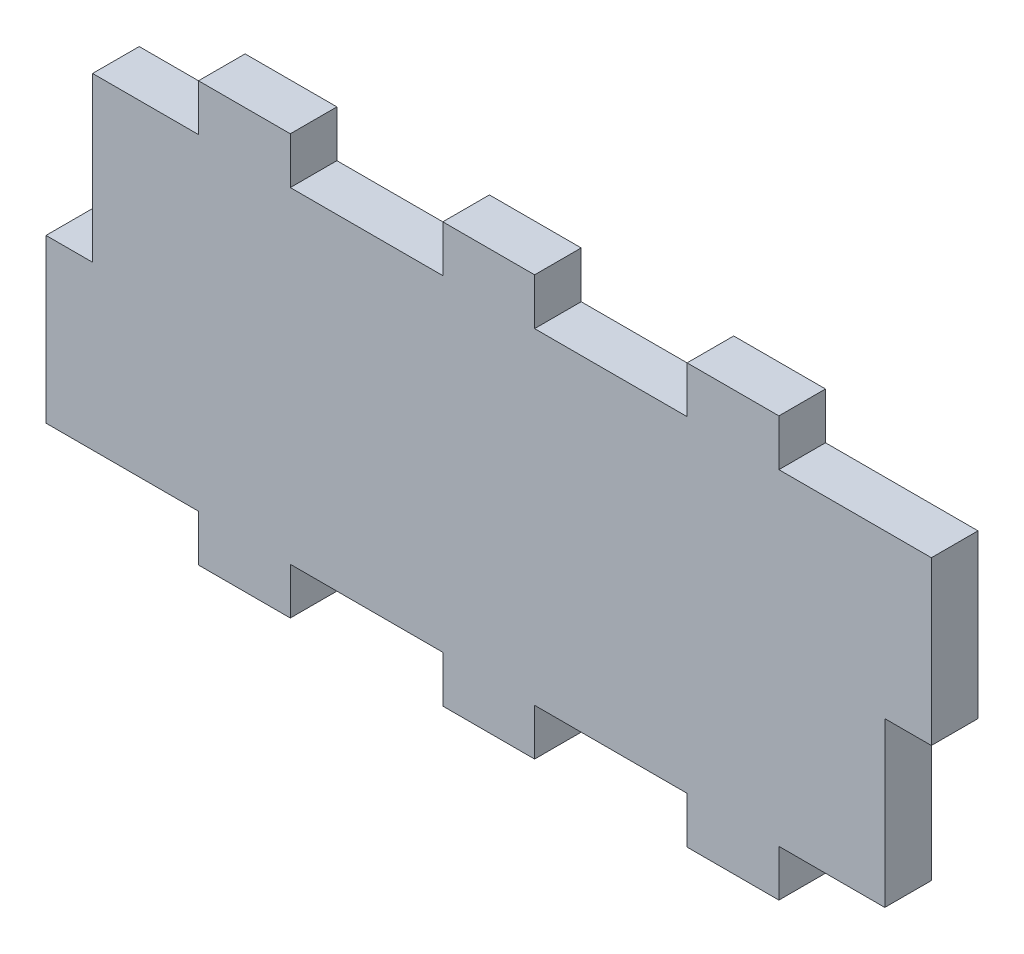
ISO-10303-21;
HEADER;
FILE_DESCRIPTION(('STEP AP214'),'2;1');
FILE_NAME('part.step','',(''),(''),'','','');
FILE_SCHEMA(('AUTOMOTIVE_DESIGN { 1 0 10303 214 1 1 1 1 }'));
ENDSEC;
DATA;
#1=APPLICATION_CONTEXT('core data for automotive mechanical design processes');
#2=APPLICATION_PROTOCOL_DEFINITION('international standard','automotive_design',2000,#1);
#3=PRODUCT_CONTEXT('',#1,'mechanical');
#4=PRODUCT('Part','Part','',(#3));
#5=PRODUCT_RELATED_PRODUCT_CATEGORY('part','',(#4));
#6=PRODUCT_DEFINITION_FORMATION('','',#4);
#7=PRODUCT_DEFINITION_CONTEXT('part definition',#1,'design');
#8=PRODUCT_DEFINITION('design','',#6,#7);
#9=PRODUCT_DEFINITION_SHAPE('','',#8);
#10=(LENGTH_UNIT() NAMED_UNIT(*) SI_UNIT(.MILLI.,.METRE.));
#11=(NAMED_UNIT(*) PLANE_ANGLE_UNIT() SI_UNIT($,.RADIAN.));
#12=(NAMED_UNIT(*) SI_UNIT($,.STERADIAN.) SOLID_ANGLE_UNIT());
#13=UNCERTAINTY_MEASURE_WITH_UNIT(LENGTH_MEASURE(1.E-05),#10,'distance_accuracy_value','');
#14=(GEOMETRIC_REPRESENTATION_CONTEXT(3) GLOBAL_UNCERTAINTY_ASSIGNED_CONTEXT((#13)) GLOBAL_UNIT_ASSIGNED_CONTEXT((#10,
#11,#12)) REPRESENTATION_CONTEXT('',''));
#15=CARTESIAN_POINT('',(0.,0.,0.));
#16=DIRECTION('',(0.,0.,1.));
#17=DIRECTION('',(1.,0.,0.));
#18=AXIS2_PLACEMENT_3D('',#15,#16,#17);
#19=CARTESIAN_POINT('',(0.,-17.5,5.));
#20=DIRECTION('',(0.,1.,0.));
#21=DIRECTION('',(-1.,0.,0.));
#22=AXIS2_PLACEMENT_3D('',#19,#20,#21);
#23=PLANE('',#22);
#24=DIRECTION('',(1.,0.,0.));
#25=VECTOR('',#24,1.);
#26=CARTESIAN_POINT('',(0.,-17.5,0.));
#27=LINE('',#26,#25);
#28=CARTESIAN_POINT('',(-47.5,-17.5,0.));
#29=VERTEX_POINT('',#28);
#30=CARTESIAN_POINT('',(-31.1375,-17.5,0.));
#31=VERTEX_POINT('',#30);
#32=EDGE_CURVE('E281',#29,#31,#27,.T.);
#33=ORIENTED_EDGE('',*,*,#32,.T.);
#34=DIRECTION('',(0.,0.,-1.));
#35=VECTOR('',#34,1.);
#36=CARTESIAN_POINT('',(-31.1375,-17.5,5.));
#37=LINE('',#36,#35);
#38=CARTESIAN_POINT('',(-31.1375,-17.5,5.));
#39=VERTEX_POINT('',#38);
#40=EDGE_CURVE('E11',#39,#31,#37,.T.);
#41=ORIENTED_EDGE('',*,*,#40,.F.);
#42=DIRECTION('',(1.,0.,0.));
#43=VECTOR('',#42,1.);
#44=CARTESIAN_POINT('',(0.,-17.5,5.));
#45=LINE('',#44,#43);
#46=CARTESIAN_POINT('',(-47.5,-17.5,5.));
#47=VERTEX_POINT('',#46);
#48=EDGE_CURVE('E357',#47,#39,#45,.T.);
#49=ORIENTED_EDGE('',*,*,#48,.F.);
#50=DIRECTION('',(0.,0.,-1.));
#51=VECTOR('',#50,1.);
#52=CARTESIAN_POINT('',(-47.5,-17.5,5.));
#53=LINE('',#52,#51);
#54=EDGE_CURVE('E52',#47,#29,#53,.T.);
#55=ORIENTED_EDGE('',*,*,#54,.T.);
#56=EDGE_LOOP('',(#33,#41,#49,#55));
#57=FACE_BOUND('',#56,.T.);
#58=ADVANCED_FACE('F35',(#57),#23,.F.);
#59=CARTESIAN_POINT('',(-31.1375,0.,5.));
#60=DIRECTION('',(1.,0.,0.));
#61=DIRECTION('',(0.,0.,-1.));
#62=AXIS2_PLACEMENT_3D('',#59,#60,#61);
#63=PLANE('',#62);
#64=DIRECTION('',(0.,-1.,0.));
#65=VECTOR('',#64,1.);
#66=CARTESIAN_POINT('',(-31.1375,0.,0.));
#67=LINE('',#66,#65);
#68=CARTESIAN_POINT('',(-31.1375,-22.5,0.));
#69=VERTEX_POINT('',#68);
#70=EDGE_CURVE('E283',#31,#69,#67,.T.);
#71=ORIENTED_EDGE('',*,*,#70,.T.);
#72=DIRECTION('',(0.,0.,-1.));
#73=VECTOR('',#72,1.);
#74=CARTESIAN_POINT('',(-31.1375,-22.5,5.));
#75=LINE('',#74,#73);
#76=CARTESIAN_POINT('',(-31.1375,-22.5,5.));
#77=VERTEX_POINT('',#76);
#78=EDGE_CURVE('E44',#77,#69,#75,.T.);
#79=ORIENTED_EDGE('',*,*,#78,.F.);
#80=DIRECTION('',(0.,-1.,0.));
#81=VECTOR('',#80,1.);
#82=CARTESIAN_POINT('',(-31.1375,0.,5.));
#83=LINE('',#82,#81);
#84=EDGE_CURVE('E163',#39,#77,#83,.T.);
#85=ORIENTED_EDGE('',*,*,#84,.F.);
#86=ORIENTED_EDGE('',*,*,#40,.T.);
#87=EDGE_LOOP('',(#71,#79,#85,#86));
#88=FACE_BOUND('',#87,.T.);
#89=ADVANCED_FACE('F37',(#88),#63,.F.);
#90=CARTESIAN_POINT('',(0.,-22.5,5.));
#91=DIRECTION('',(0.,1.,0.));
#92=DIRECTION('',(0.,0.,1.));
#93=AXIS2_PLACEMENT_3D('',#90,#91,#92);
#94=PLANE('',#93);
#95=DIRECTION('',(1.,0.,0.));
#96=VECTOR('',#95,1.);
#97=CARTESIAN_POINT('',(0.,-22.5,0.));
#98=LINE('',#97,#96);
#99=CARTESIAN_POINT('',(-21.2875,-22.5,0.));
#100=VERTEX_POINT('',#99);
#101=EDGE_CURVE('E287',#69,#100,#98,.T.);
#102=ORIENTED_EDGE('',*,*,#101,.T.);
#103=DIRECTION('',(0.,0.,-1.));
#104=VECTOR('',#103,1.);
#105=CARTESIAN_POINT('',(-21.2875,-22.5,5.));
#106=LINE('',#105,#104);
#107=CARTESIAN_POINT('',(-21.2875,-22.5,5.));
#108=VERTEX_POINT('',#107);
#109=EDGE_CURVE('E417',#108,#100,#106,.T.);
#110=ORIENTED_EDGE('',*,*,#109,.F.);
#111=DIRECTION('',(1.,0.,0.));
#112=VECTOR('',#111,1.);
#113=CARTESIAN_POINT('',(0.,-22.5,5.));
#114=LINE('',#113,#112);
#115=EDGE_CURVE('E424',#77,#108,#114,.T.);
#116=ORIENTED_EDGE('',*,*,#115,.F.);
#117=ORIENTED_EDGE('',*,*,#78,.T.);
#118=EDGE_LOOP('',(#102,#110,#116,#117));
#119=FACE_BOUND('',#118,.T.);
#120=ADVANCED_FACE('F422',(#119),#94,.F.);
#121=CARTESIAN_POINT('',(-21.2875,0.,5.));
#122=DIRECTION('',(1.,0.,0.));
#123=DIRECTION('',(0.,0.,-1.));
#124=AXIS2_PLACEMENT_3D('',#121,#122,#123);
#125=PLANE('',#124);
#126=DIRECTION('',(0.,-1.,0.));
#127=VECTOR('',#126,1.);
#128=CARTESIAN_POINT('',(-21.2875,0.,0.));
#129=LINE('',#128,#127);
#130=CARTESIAN_POINT('',(-21.2875,-17.5,0.));
#131=VERTEX_POINT('',#130);
#132=EDGE_CURVE('E290',#131,#100,#129,.T.);
#133=ORIENTED_EDGE('',*,*,#132,.F.);
#134=DIRECTION('',(0.,0.,-1.));
#135=VECTOR('',#134,1.);
#136=CARTESIAN_POINT('',(-21.2875,-17.5,5.));
#137=LINE('',#136,#135);
#138=CARTESIAN_POINT('',(-21.2875,-17.5,5.));
#139=VERTEX_POINT('',#138);
#140=EDGE_CURVE('E415',#139,#131,#137,.T.);
#141=ORIENTED_EDGE('',*,*,#140,.F.);
#142=DIRECTION('',(0.,-1.,0.));
#143=VECTOR('',#142,1.);
#144=CARTESIAN_POINT('',(-21.2875,0.,5.));
#145=LINE('',#144,#143);
#146=EDGE_CURVE('E435',#139,#108,#145,.T.);
#147=ORIENTED_EDGE('',*,*,#146,.T.);
#148=ORIENTED_EDGE('',*,*,#109,.T.);
#149=EDGE_LOOP('',(#133,#141,#147,#148));
#150=FACE_BOUND('',#149,.T.);
#151=ADVANCED_FACE('F431',(#150),#125,.T.);
#152=CARTESIAN_POINT('',(-4.92499999999999,-17.5,0.));
#153=VERTEX_POINT('',#152);
#154=EDGE_CURVE('E285',#131,#153,#27,.T.);
#155=ORIENTED_EDGE('',*,*,#154,.T.);
#156=DIRECTION('',(0.,0.,-1.));
#157=VECTOR('',#156,1.);
#158=CARTESIAN_POINT('',(-4.92499999999999,-17.5,5.));
#159=LINE('',#158,#157);
#160=CARTESIAN_POINT('',(-4.92499999999999,-17.5,5.));
#161=VERTEX_POINT('',#160);
#162=EDGE_CURVE('E412',#161,#153,#159,.T.);
#163=ORIENTED_EDGE('',*,*,#162,.F.);
#164=EDGE_CURVE('E436',#139,#161,#45,.T.);
#165=ORIENTED_EDGE('',*,*,#164,.F.);
#166=ORIENTED_EDGE('',*,*,#140,.T.);
#167=EDGE_LOOP('',(#155,#163,#165,#166));
#168=FACE_BOUND('',#167,.T.);
#169=ADVANCED_FACE('F511',(#168),#23,.F.);
#170=CARTESIAN_POINT('',(-4.92499999999999,0.,5.));
#171=DIRECTION('',(1.,0.,0.));
#172=DIRECTION('',(0.,0.,-1.));
#173=AXIS2_PLACEMENT_3D('',#170,#171,#172);
#174=PLANE('',#173);
#175=DIRECTION('',(0.,-1.,0.));
#176=VECTOR('',#175,1.);
#177=CARTESIAN_POINT('',(-4.92499999999999,0.,0.));
#178=LINE('',#177,#176);
#179=CARTESIAN_POINT('',(-4.92499999999999,-22.5,0.));
#180=VERTEX_POINT('',#179);
#181=EDGE_CURVE('E293',#153,#180,#178,.T.);
#182=ORIENTED_EDGE('',*,*,#181,.T.);
#183=DIRECTION('',(0.,0.,-1.));
#184=VECTOR('',#183,1.);
#185=CARTESIAN_POINT('',(-4.92499999999999,-22.5,5.));
#186=LINE('',#185,#184);
#187=CARTESIAN_POINT('',(-4.92499999999999,-22.5,5.));
#188=VERTEX_POINT('',#187);
#189=EDGE_CURVE('E409',#188,#180,#186,.T.);
#190=ORIENTED_EDGE('',*,*,#189,.F.);
#191=DIRECTION('',(0.,-1.,0.));
#192=VECTOR('',#191,1.);
#193=CARTESIAN_POINT('',(-4.92499999999999,0.,5.));
#194=LINE('',#193,#192);
#195=EDGE_CURVE('E438',#161,#188,#194,.T.);
#196=ORIENTED_EDGE('',*,*,#195,.F.);
#197=ORIENTED_EDGE('',*,*,#162,.T.);
#198=EDGE_LOOP('',(#182,#190,#196,#197));
#199=FACE_BOUND('',#198,.T.);
#200=ADVANCED_FACE('F519',(#199),#174,.F.);
#201=CARTESIAN_POINT('',(0.,-22.5,5.));
#202=DIRECTION('',(0.,1.,0.));
#203=DIRECTION('',(0.,0.,1.));
#204=AXIS2_PLACEMENT_3D('',#201,#202,#203);
#205=PLANE('',#204);
#206=DIRECTION('',(1.,0.,0.));
#207=VECTOR('',#206,1.);
#208=CARTESIAN_POINT('',(0.,-22.5,0.));
#209=LINE('',#208,#207);
#210=CARTESIAN_POINT('',(4.92500000000001,-22.5,0.));
#211=VERTEX_POINT('',#210);
#212=EDGE_CURVE('E295',#180,#211,#209,.T.);
#213=ORIENTED_EDGE('',*,*,#212,.T.);
#214=DIRECTION('',(0.,0.,-1.));
#215=VECTOR('',#214,1.);
#216=CARTESIAN_POINT('',(4.92500000000001,-22.5,5.));
#217=LINE('',#216,#215);
#218=CARTESIAN_POINT('',(4.92500000000001,-22.5,5.));
#219=VERTEX_POINT('',#218);
#220=EDGE_CURVE('E407',#219,#211,#217,.T.);
#221=ORIENTED_EDGE('',*,*,#220,.F.);
#222=DIRECTION('',(1.,0.,0.));
#223=VECTOR('',#222,1.);
#224=CARTESIAN_POINT('',(0.,-22.5,5.));
#225=LINE('',#224,#223);
#226=EDGE_CURVE('E445',#188,#219,#225,.T.);
#227=ORIENTED_EDGE('',*,*,#226,.F.);
#228=ORIENTED_EDGE('',*,*,#189,.T.);
#229=EDGE_LOOP('',(#213,#221,#227,#228));
#230=FACE_BOUND('',#229,.T.);
#231=ADVANCED_FACE('F544',(#230),#205,.F.);
#232=CARTESIAN_POINT('',(4.92500000000001,0.,5.));
#233=DIRECTION('',(1.,0.,0.));
#234=DIRECTION('',(0.,0.,-1.));
#235=AXIS2_PLACEMENT_3D('',#232,#233,#234);
#236=PLANE('',#235);
#237=DIRECTION('',(0.,-1.,0.));
#238=VECTOR('',#237,1.);
#239=CARTESIAN_POINT('',(4.92500000000001,0.,0.));
#240=LINE('',#239,#238);
#241=CARTESIAN_POINT('',(4.92500000000001,-17.5,0.));
#242=VERTEX_POINT('',#241);
#243=EDGE_CURVE('E298',#242,#211,#240,.T.);
#244=ORIENTED_EDGE('',*,*,#243,.F.);
#245=DIRECTION('',(0.,0.,-1.));
#246=VECTOR('',#245,1.);
#247=CARTESIAN_POINT('',(4.92500000000001,-17.5,5.));
#248=LINE('',#247,#246);
#249=CARTESIAN_POINT('',(4.92500000000001,-17.5,5.));
#250=VERTEX_POINT('',#249);
#251=EDGE_CURVE('E405',#250,#242,#248,.T.);
#252=ORIENTED_EDGE('',*,*,#251,.F.);
#253=DIRECTION('',(0.,-1.,0.));
#254=VECTOR('',#253,1.);
#255=CARTESIAN_POINT('',(4.92500000000001,0.,5.));
#256=LINE('',#255,#254);
#257=EDGE_CURVE('E447',#250,#219,#256,.T.);
#258=ORIENTED_EDGE('',*,*,#257,.T.);
#259=ORIENTED_EDGE('',*,*,#220,.T.);
#260=EDGE_LOOP('',(#244,#252,#258,#259));
#261=FACE_BOUND('',#260,.T.);
#262=ADVANCED_FACE('F536',(#261),#236,.T.);
#263=CARTESIAN_POINT('',(21.2875,-17.5,0.));
#264=VERTEX_POINT('',#263);
#265=EDGE_CURVE('E301',#242,#264,#27,.T.);
#266=ORIENTED_EDGE('',*,*,#265,.T.);
#267=DIRECTION('',(0.,0.,-1.));
#268=VECTOR('',#267,1.);
#269=CARTESIAN_POINT('',(21.2875,-17.5,5.));
#270=LINE('',#269,#268);
#271=CARTESIAN_POINT('',(21.2875,-17.5,5.));
#272=VERTEX_POINT('',#271);
#273=EDGE_CURVE('E402',#272,#264,#270,.T.);
#274=ORIENTED_EDGE('',*,*,#273,.F.);
#275=EDGE_CURVE('E440',#250,#272,#45,.T.);
#276=ORIENTED_EDGE('',*,*,#275,.F.);
#277=ORIENTED_EDGE('',*,*,#251,.T.);
#278=EDGE_LOOP('',(#266,#274,#276,#277));
#279=FACE_BOUND('',#278,.T.);
#280=ADVANCED_FACE('F521',(#279),#23,.F.);
#281=CARTESIAN_POINT('',(21.2875,0.,5.));
#282=DIRECTION('',(1.,0.,0.));
#283=DIRECTION('',(0.,0.,-1.));
#284=AXIS2_PLACEMENT_3D('',#281,#282,#283);
#285=PLANE('',#284);
#286=DIRECTION('',(0.,-1.,0.));
#287=VECTOR('',#286,1.);
#288=CARTESIAN_POINT('',(21.2875,0.,0.));
#289=LINE('',#288,#287);
#290=CARTESIAN_POINT('',(21.2875,-22.5,0.));
#291=VERTEX_POINT('',#290);
#292=EDGE_CURVE('E302',#264,#291,#289,.T.);
#293=ORIENTED_EDGE('',*,*,#292,.T.);
#294=DIRECTION('',(0.,0.,-1.));
#295=VECTOR('',#294,1.);
#296=CARTESIAN_POINT('',(21.2875,-22.5,5.));
#297=LINE('',#296,#295);
#298=CARTESIAN_POINT('',(21.2875,-22.5,5.));
#299=VERTEX_POINT('',#298);
#300=EDGE_CURVE('E399',#299,#291,#297,.T.);
#301=ORIENTED_EDGE('',*,*,#300,.F.);
#302=DIRECTION('',(0.,-1.,0.));
#303=VECTOR('',#302,1.);
#304=CARTESIAN_POINT('',(21.2875,0.,5.));
#305=LINE('',#304,#303);
#306=EDGE_CURVE('E450',#272,#299,#305,.T.);
#307=ORIENTED_EDGE('',*,*,#306,.F.);
#308=ORIENTED_EDGE('',*,*,#273,.T.);
#309=EDGE_LOOP('',(#293,#301,#307,#308));
#310=FACE_BOUND('',#309,.T.);
#311=ADVANCED_FACE('F535',(#310),#285,.F.);
#312=CARTESIAN_POINT('',(0.,-22.5,5.));
#313=DIRECTION('',(0.,1.,0.));
#314=DIRECTION('',(0.,0.,1.));
#315=AXIS2_PLACEMENT_3D('',#312,#313,#314);
#316=PLANE('',#315);
#317=DIRECTION('',(1.,0.,0.));
#318=VECTOR('',#317,1.);
#319=CARTESIAN_POINT('',(0.,-22.5,0.));
#320=LINE('',#319,#318);
#321=CARTESIAN_POINT('',(31.1375,-22.5,0.));
#322=VERTEX_POINT('',#321);
#323=EDGE_CURVE('E304',#291,#322,#320,.T.);
#324=ORIENTED_EDGE('',*,*,#323,.T.);
#325=DIRECTION('',(0.,0.,-1.));
#326=VECTOR('',#325,1.);
#327=CARTESIAN_POINT('',(31.1375,-22.5,5.));
#328=LINE('',#327,#326);
#329=CARTESIAN_POINT('',(31.1375,-22.5,5.));
#330=VERTEX_POINT('',#329);
#331=EDGE_CURVE('E397',#330,#322,#328,.T.);
#332=ORIENTED_EDGE('',*,*,#331,.F.);
#333=DIRECTION('',(1.,0.,0.));
#334=VECTOR('',#333,1.);
#335=CARTESIAN_POINT('',(0.,-22.5,5.));
#336=LINE('',#335,#334);
#337=EDGE_CURVE('E452',#299,#330,#336,.T.);
#338=ORIENTED_EDGE('',*,*,#337,.F.);
#339=ORIENTED_EDGE('',*,*,#300,.T.);
#340=EDGE_LOOP('',(#324,#332,#338,#339));
#341=FACE_BOUND('',#340,.T.);
#342=ADVANCED_FACE('F532',(#341),#316,.F.);
#343=CARTESIAN_POINT('',(31.1375,0.,5.));
#344=DIRECTION('',(1.,0.,0.));
#345=DIRECTION('',(0.,0.,-1.));
#346=AXIS2_PLACEMENT_3D('',#343,#344,#345);
#347=PLANE('',#346);
#348=DIRECTION('',(0.,-1.,0.));
#349=VECTOR('',#348,1.);
#350=CARTESIAN_POINT('',(31.1375,0.,0.));
#351=LINE('',#350,#349);
#352=CARTESIAN_POINT('',(31.1375,-17.5,0.));
#353=VERTEX_POINT('',#352);
#354=EDGE_CURVE('E307',#353,#322,#351,.T.);
#355=ORIENTED_EDGE('',*,*,#354,.F.);
#356=DIRECTION('',(0.,0.,-1.));
#357=VECTOR('',#356,1.);
#358=CARTESIAN_POINT('',(31.1375,-17.5,5.));
#359=LINE('',#358,#357);
#360=CARTESIAN_POINT('',(31.1375,-17.5,5.));
#361=VERTEX_POINT('',#360);
#362=EDGE_CURVE('E395',#361,#353,#359,.T.);
#363=ORIENTED_EDGE('',*,*,#362,.F.);
#364=DIRECTION('',(0.,-1.,0.));
#365=VECTOR('',#364,1.);
#366=CARTESIAN_POINT('',(31.1375,0.,5.));
#367=LINE('',#366,#365);
#368=EDGE_CURVE('E454',#361,#330,#367,.T.);
#369=ORIENTED_EDGE('',*,*,#368,.T.);
#370=ORIENTED_EDGE('',*,*,#331,.T.);
#371=EDGE_LOOP('',(#355,#363,#369,#370));
#372=FACE_BOUND('',#371,.T.);
#373=ADVANCED_FACE('F524',(#372),#347,.T.);
#374=CARTESIAN_POINT('',(42.5,-17.5,0.));
#375=VERTEX_POINT('',#374);
#376=EDGE_CURVE('E284',#353,#375,#27,.T.);
#377=ORIENTED_EDGE('',*,*,#376,.T.);
#378=DIRECTION('',(0.,0.,-1.));
#379=VECTOR('',#378,1.);
#380=CARTESIAN_POINT('',(42.5,-17.5,5.));
#381=LINE('',#380,#379);
#382=CARTESIAN_POINT('',(42.5,-17.5,5.));
#383=VERTEX_POINT('',#382);
#384=EDGE_CURVE('E392',#383,#375,#381,.T.);
#385=ORIENTED_EDGE('',*,*,#384,.F.);
#386=EDGE_CURVE('E457',#361,#383,#45,.T.);
#387=ORIENTED_EDGE('',*,*,#386,.F.);
#388=ORIENTED_EDGE('',*,*,#362,.T.);
#389=EDGE_LOOP('',(#377,#385,#387,#388));
#390=FACE_BOUND('',#389,.T.);
#391=ADVANCED_FACE('F512',(#390),#23,.F.);
#392=CARTESIAN_POINT('',(42.5,0.,5.));
#393=DIRECTION('',(-1.,0.,0.));
#394=DIRECTION('',(0.,-1.,0.));
#395=AXIS2_PLACEMENT_3D('',#392,#393,#394);
#396=PLANE('',#395);
#397=DIRECTION('',(0.,1.,0.));
#398=VECTOR('',#397,1.);
#399=CARTESIAN_POINT('',(42.5,0.,0.));
#400=LINE('',#399,#398);
#401=CARTESIAN_POINT('',(42.5,0.0500000000000118,0.));
#402=VERTEX_POINT('',#401);
#403=EDGE_CURVE('E310',#375,#402,#400,.T.);
#404=ORIENTED_EDGE('',*,*,#403,.T.);
#405=DIRECTION('',(0.,0.,-1.));
#406=VECTOR('',#405,1.);
#407=CARTESIAN_POINT('',(42.5,0.0500000000000118,5.));
#408=LINE('',#407,#406);
#409=CARTESIAN_POINT('',(42.5,0.0500000000000118,5.));
#410=VERTEX_POINT('',#409);
#411=EDGE_CURVE('E389',#410,#402,#408,.T.);
#412=ORIENTED_EDGE('',*,*,#411,.F.);
#413=DIRECTION('',(0.,1.,0.));
#414=VECTOR('',#413,1.);
#415=CARTESIAN_POINT('',(42.5,0.,5.));
#416=LINE('',#415,#414);
#417=EDGE_CURVE('E458',#383,#410,#416,.T.);
#418=ORIENTED_EDGE('',*,*,#417,.F.);
#419=ORIENTED_EDGE('',*,*,#384,.T.);
#420=EDGE_LOOP('',(#404,#412,#418,#419));
#421=FACE_BOUND('',#420,.T.);
#422=ADVANCED_FACE('F523',(#421),#396,.F.);
#423=CARTESIAN_POINT('',(0.,0.0500000000000118,5.));
#424=DIRECTION('',(0.,1.,0.));
#425=DIRECTION('',(0.,0.,1.));
#426=AXIS2_PLACEMENT_3D('',#423,#424,#425);
#427=PLANE('',#426);
#428=DIRECTION('',(1.,0.,0.));
#429=VECTOR('',#428,1.);
#430=CARTESIAN_POINT('',(0.,0.0500000000000118,0.));
#431=LINE('',#430,#429);
#432=CARTESIAN_POINT('',(47.5,0.0500000000000118,0.));
#433=VERTEX_POINT('',#432);
#434=EDGE_CURVE('E312',#402,#433,#431,.T.);
#435=ORIENTED_EDGE('',*,*,#434,.T.);
#436=DIRECTION('',(0.,0.,-1.));
#437=VECTOR('',#436,1.);
#438=CARTESIAN_POINT('',(47.5,0.0500000000000118,5.));
#439=LINE('',#438,#437);
#440=CARTESIAN_POINT('',(47.5,0.0500000000000118,5.));
#441=VERTEX_POINT('',#440);
#442=EDGE_CURVE('E387',#441,#433,#439,.T.);
#443=ORIENTED_EDGE('',*,*,#442,.F.);
#444=DIRECTION('',(1.,0.,0.));
#445=VECTOR('',#444,1.);
#446=CARTESIAN_POINT('',(0.,0.0500000000000118,5.));
#447=LINE('',#446,#445);
#448=EDGE_CURVE('E460',#410,#441,#447,.T.);
#449=ORIENTED_EDGE('',*,*,#448,.F.);
#450=ORIENTED_EDGE('',*,*,#411,.T.);
#451=EDGE_LOOP('',(#435,#443,#449,#450));
#452=FACE_BOUND('',#451,.T.);
#453=ADVANCED_FACE('F530',(#452),#427,.F.);
#454=CARTESIAN_POINT('',(47.5,1.13328639691322E-13,5.));
#455=DIRECTION('',(1.,0.,0.));
#456=DIRECTION('',(0.,1.,0.));
#457=AXIS2_PLACEMENT_3D('',#454,#455,#456);
#458=PLANE('',#457);
#459=DIRECTION('',(0.,-1.,0.));
#460=VECTOR('',#459,1.);
#461=CARTESIAN_POINT('',(47.5,1.13328639691322E-13,0.));
#462=LINE('',#461,#460);
#463=CARTESIAN_POINT('',(47.5,17.5,0.));
#464=VERTEX_POINT('',#463);
#465=EDGE_CURVE('E315',#464,#433,#462,.T.);
#466=ORIENTED_EDGE('',*,*,#465,.F.);
#467=DIRECTION('',(0.,0.,-1.));
#468=VECTOR('',#467,1.);
#469=CARTESIAN_POINT('',(47.5,17.5,5.));
#470=LINE('',#469,#468);
#471=CARTESIAN_POINT('',(47.5,17.5,5.));
#472=VERTEX_POINT('',#471);
#473=EDGE_CURVE('E385',#472,#464,#470,.T.);
#474=ORIENTED_EDGE('',*,*,#473,.F.);
#475=DIRECTION('',(0.,-1.,0.));
#476=VECTOR('',#475,1.);
#477=CARTESIAN_POINT('',(47.5,1.13328639691322E-13,5.));
#478=LINE('',#477,#476);
#479=EDGE_CURVE('E462',#472,#441,#478,.T.);
#480=ORIENTED_EDGE('',*,*,#479,.T.);
#481=ORIENTED_EDGE('',*,*,#442,.T.);
#482=EDGE_LOOP('',(#466,#474,#480,#481));
#483=FACE_BOUND('',#482,.T.);
#484=ADVANCED_FACE('F634',(#483),#458,.T.);
#485=CARTESIAN_POINT('',(0.,17.5,5.));
#486=DIRECTION('',(0.,1.,0.));
#487=DIRECTION('',(0.,0.,1.));
#488=AXIS2_PLACEMENT_3D('',#485,#486,#487);
#489=PLANE('',#488);
#490=DIRECTION('',(1.,0.,0.));
#491=VECTOR('',#490,1.);
#492=CARTESIAN_POINT('',(0.,17.5,0.));
#493=LINE('',#492,#491);
#494=CARTESIAN_POINT('',(31.1374999999999,17.5,0.));
#495=VERTEX_POINT('',#494);
#496=EDGE_CURVE('E318',#495,#464,#493,.T.);
#497=ORIENTED_EDGE('',*,*,#496,.F.);
#498=DIRECTION('',(0.,0.,-1.));
#499=VECTOR('',#498,1.);
#500=CARTESIAN_POINT('',(31.1374999999999,17.5,5.));
#501=LINE('',#500,#499);
#502=CARTESIAN_POINT('',(31.1374999999999,17.5,5.));
#503=VERTEX_POINT('',#502);
#504=EDGE_CURVE('E383',#503,#495,#501,.T.);
#505=ORIENTED_EDGE('',*,*,#504,.F.);
#506=DIRECTION('',(1.,0.,0.));
#507=VECTOR('',#506,1.);
#508=CARTESIAN_POINT('',(0.,17.5,5.));
#509=LINE('',#508,#507);
#510=EDGE_CURVE('E276',#503,#472,#509,.T.);
#511=ORIENTED_EDGE('',*,*,#510,.T.);
#512=ORIENTED_EDGE('',*,*,#473,.T.);
#513=EDGE_LOOP('',(#497,#505,#511,#512));
#514=FACE_BOUND('',#513,.T.);
#515=ADVANCED_FACE('F578',(#514),#489,.T.);
#516=CARTESIAN_POINT('',(31.1374999999999,0.,5.));
#517=DIRECTION('',(1.,0.,0.));
#518=DIRECTION('',(0.,0.,-1.));
#519=AXIS2_PLACEMENT_3D('',#516,#517,#518);
#520=PLANE('',#519);
#521=DIRECTION('',(0.,-1.,0.));
#522=VECTOR('',#521,1.);
#523=CARTESIAN_POINT('',(31.1374999999999,0.,0.));
#524=LINE('',#523,#522);
#525=CARTESIAN_POINT('',(31.1374999999999,22.5,0.));
#526=VERTEX_POINT('',#525);
#527=EDGE_CURVE('E321',#526,#495,#524,.T.);
#528=ORIENTED_EDGE('',*,*,#527,.F.);
#529=DIRECTION('',(0.,0.,-1.));
#530=VECTOR('',#529,1.);
#531=CARTESIAN_POINT('',(31.1374999999999,22.5,5.));
#532=LINE('',#531,#530);
#533=CARTESIAN_POINT('',(31.1374999999999,22.5,5.));
#534=VERTEX_POINT('',#533);
#535=EDGE_CURVE('E381',#534,#526,#532,.T.);
#536=ORIENTED_EDGE('',*,*,#535,.F.);
#537=DIRECTION('',(0.,-1.,0.));
#538=VECTOR('',#537,1.);
#539=CARTESIAN_POINT('',(31.1374999999999,0.,5.));
#540=LINE('',#539,#538);
#541=EDGE_CURVE('E466',#534,#503,#540,.T.);
#542=ORIENTED_EDGE('',*,*,#541,.T.);
#543=ORIENTED_EDGE('',*,*,#504,.T.);
#544=EDGE_LOOP('',(#528,#536,#542,#543));
#545=FACE_BOUND('',#544,.T.);
#546=ADVANCED_FACE('F582',(#545),#520,.T.);
#547=CARTESIAN_POINT('',(0.,22.5,5.));
#548=DIRECTION('',(0.,1.,0.));
#549=DIRECTION('',(-1.,0.,0.));
#550=AXIS2_PLACEMENT_3D('',#547,#548,#549);
#551=PLANE('',#550);
#552=DIRECTION('',(1.,0.,0.));
#553=VECTOR('',#552,1.);
#554=CARTESIAN_POINT('',(0.,22.5,0.));
#555=LINE('',#554,#553);
#556=CARTESIAN_POINT('',(21.2874999999999,22.5,0.));
#557=VERTEX_POINT('',#556);
#558=EDGE_CURVE('E326',#557,#526,#555,.T.);
#559=ORIENTED_EDGE('',*,*,#558,.F.);
#560=DIRECTION('',(0.,0.,-1.));
#561=VECTOR('',#560,1.);
#562=CARTESIAN_POINT('',(21.2874999999999,22.5,5.));
#563=LINE('',#562,#561);
#564=CARTESIAN_POINT('',(21.2874999999999,22.5,5.));
#565=VERTEX_POINT('',#564);
#566=EDGE_CURVE('E379',#565,#557,#563,.T.);
#567=ORIENTED_EDGE('',*,*,#566,.F.);
#568=DIRECTION('',(1.,0.,0.));
#569=VECTOR('',#568,1.);
#570=CARTESIAN_POINT('',(0.,22.5,5.));
#571=LINE('',#570,#569);
#572=EDGE_CURVE('E470',#565,#534,#571,.T.);
#573=ORIENTED_EDGE('',*,*,#572,.T.);
#574=ORIENTED_EDGE('',*,*,#535,.T.);
#575=EDGE_LOOP('',(#559,#567,#573,#574));
#576=FACE_BOUND('',#575,.T.);
#577=ADVANCED_FACE('F586',(#576),#551,.T.);
#578=CARTESIAN_POINT('',(21.2874999999999,0.,5.));
#579=DIRECTION('',(1.,0.,0.));
#580=DIRECTION('',(0.,0.,-1.));
#581=AXIS2_PLACEMENT_3D('',#578,#579,#580);
#582=PLANE('',#581);
#583=DIRECTION('',(0.,-1.,0.));
#584=VECTOR('',#583,1.);
#585=CARTESIAN_POINT('',(21.2874999999999,0.,0.));
#586=LINE('',#585,#584);
#587=CARTESIAN_POINT('',(21.2874999999999,17.5,0.));
#588=VERTEX_POINT('',#587);
#589=EDGE_CURVE('E329',#557,#588,#586,.T.);
#590=ORIENTED_EDGE('',*,*,#589,.T.);
#591=DIRECTION('',(0.,0.,-1.));
#592=VECTOR('',#591,1.);
#593=CARTESIAN_POINT('',(21.2874999999999,17.5,5.));
#594=LINE('',#593,#592);
#595=CARTESIAN_POINT('',(21.2874999999999,17.5,5.));
#596=VERTEX_POINT('',#595);
#597=EDGE_CURVE('E377',#596,#588,#594,.T.);
#598=ORIENTED_EDGE('',*,*,#597,.F.);
#599=DIRECTION('',(0.,-1.,0.));
#600=VECTOR('',#599,1.);
#601=CARTESIAN_POINT('',(21.2874999999999,0.,5.));
#602=LINE('',#601,#600);
#603=EDGE_CURVE('E473',#565,#596,#602,.T.);
#604=ORIENTED_EDGE('',*,*,#603,.F.);
#605=ORIENTED_EDGE('',*,*,#566,.T.);
#606=EDGE_LOOP('',(#590,#598,#604,#605));
#607=FACE_BOUND('',#606,.T.);
#608=ADVANCED_FACE('F591',(#607),#582,.F.);
#609=CARTESIAN_POINT('',(4.92499999999987,17.5,0.));
#610=VERTEX_POINT('',#609);
#611=EDGE_CURVE('E323',#610,#588,#493,.T.);
#612=ORIENTED_EDGE('',*,*,#611,.F.);
#613=DIRECTION('',(0.,0.,-1.));
#614=VECTOR('',#613,1.);
#615=CARTESIAN_POINT('',(4.92499999999987,17.5,5.));
#616=LINE('',#615,#614);
#617=CARTESIAN_POINT('',(4.92499999999987,17.5,5.));
#618=VERTEX_POINT('',#617);
#619=EDGE_CURVE('E375',#618,#610,#616,.T.);
#620=ORIENTED_EDGE('',*,*,#619,.F.);
#621=EDGE_CURVE('E467',#618,#596,#509,.T.);
#622=ORIENTED_EDGE('',*,*,#621,.T.);
#623=ORIENTED_EDGE('',*,*,#597,.T.);
#624=EDGE_LOOP('',(#612,#620,#622,#623));
#625=FACE_BOUND('',#624,.T.);
#626=ADVANCED_FACE('F621',(#625),#489,.T.);
#627=CARTESIAN_POINT('',(4.92499999999987,0.,5.));
#628=DIRECTION('',(1.,0.,0.));
#629=DIRECTION('',(0.,0.,-1.));
#630=AXIS2_PLACEMENT_3D('',#627,#628,#629);
#631=PLANE('',#630);
#632=DIRECTION('',(0.,-1.,0.));
#633=VECTOR('',#632,1.);
#634=CARTESIAN_POINT('',(4.92499999999987,0.,0.));
#635=LINE('',#634,#633);
#636=CARTESIAN_POINT('',(4.92499999999987,22.5,0.));
#637=VERTEX_POINT('',#636);
#638=EDGE_CURVE('E332',#637,#610,#635,.T.);
#639=ORIENTED_EDGE('',*,*,#638,.F.);
#640=DIRECTION('',(0.,0.,-1.));
#641=VECTOR('',#640,1.);
#642=CARTESIAN_POINT('',(4.92499999999987,22.5,5.));
#643=LINE('',#642,#641);
#644=CARTESIAN_POINT('',(4.92499999999987,22.5,5.));
#645=VERTEX_POINT('',#644);
#646=EDGE_CURVE('E373',#645,#637,#643,.T.);
#647=ORIENTED_EDGE('',*,*,#646,.F.);
#648=DIRECTION('',(0.,-1.,0.));
#649=VECTOR('',#648,1.);
#650=CARTESIAN_POINT('',(4.92499999999987,0.,5.));
#651=LINE('',#650,#649);
#652=EDGE_CURVE('E475',#645,#618,#651,.T.);
#653=ORIENTED_EDGE('',*,*,#652,.T.);
#654=ORIENTED_EDGE('',*,*,#619,.T.);
#655=EDGE_LOOP('',(#639,#647,#653,#654));
#656=FACE_BOUND('',#655,.T.);
#657=ADVANCED_FACE('F599',(#656),#631,.T.);
#658=CARTESIAN_POINT('',(0.,22.5,5.));
#659=DIRECTION('',(0.,1.,0.));
#660=DIRECTION('',(-1.,0.,0.));
#661=AXIS2_PLACEMENT_3D('',#658,#659,#660);
#662=PLANE('',#661);
#663=DIRECTION('',(1.,0.,0.));
#664=VECTOR('',#663,1.);
#665=CARTESIAN_POINT('',(0.,22.5,0.));
#666=LINE('',#665,#664);
#667=CARTESIAN_POINT('',(-4.92500000000013,22.5,0.));
#668=VERTEX_POINT('',#667);
#669=EDGE_CURVE('E335',#668,#637,#666,.T.);
#670=ORIENTED_EDGE('',*,*,#669,.F.);
#671=DIRECTION('',(0.,0.,-1.));
#672=VECTOR('',#671,1.);
#673=CARTESIAN_POINT('',(-4.92500000000013,22.5,5.));
#674=LINE('',#673,#672);
#675=CARTESIAN_POINT('',(-4.92500000000013,22.5,5.));
#676=VERTEX_POINT('',#675);
#677=EDGE_CURVE('E371',#676,#668,#674,.T.);
#678=ORIENTED_EDGE('',*,*,#677,.F.);
#679=DIRECTION('',(1.,0.,0.));
#680=VECTOR('',#679,1.);
#681=CARTESIAN_POINT('',(0.,22.5,5.));
#682=LINE('',#681,#680);
#683=EDGE_CURVE('E478',#676,#645,#682,.T.);
#684=ORIENTED_EDGE('',*,*,#683,.T.);
#685=ORIENTED_EDGE('',*,*,#646,.T.);
#686=EDGE_LOOP('',(#670,#678,#684,#685));
#687=FACE_BOUND('',#686,.T.);
#688=ADVANCED_FACE('F603',(#687),#662,.T.);
#689=CARTESIAN_POINT('',(-4.92500000000013,0.,5.));
#690=DIRECTION('',(1.,0.,0.));
#691=DIRECTION('',(0.,0.,-1.));
#692=AXIS2_PLACEMENT_3D('',#689,#690,#691);
#693=PLANE('',#692);
#694=DIRECTION('',(0.,-1.,0.));
#695=VECTOR('',#694,1.);
#696=CARTESIAN_POINT('',(-4.92500000000013,0.,0.));
#697=LINE('',#696,#695);
#698=CARTESIAN_POINT('',(-4.92500000000013,17.5,0.));
#699=VERTEX_POINT('',#698);
#700=EDGE_CURVE('E338',#668,#699,#697,.T.);
#701=ORIENTED_EDGE('',*,*,#700,.T.);
#702=DIRECTION('',(0.,0.,-1.));
#703=VECTOR('',#702,1.);
#704=CARTESIAN_POINT('',(-4.92500000000013,17.5,5.));
#705=LINE('',#704,#703);
#706=CARTESIAN_POINT('',(-4.92500000000013,17.5,5.));
#707=VERTEX_POINT('',#706);
#708=EDGE_CURVE('E369',#707,#699,#705,.T.);
#709=ORIENTED_EDGE('',*,*,#708,.F.);
#710=DIRECTION('',(0.,-1.,0.));
#711=VECTOR('',#710,1.);
#712=CARTESIAN_POINT('',(-4.92500000000013,0.,5.));
#713=LINE('',#712,#711);
#714=EDGE_CURVE('E481',#676,#707,#713,.T.);
#715=ORIENTED_EDGE('',*,*,#714,.F.);
#716=ORIENTED_EDGE('',*,*,#677,.T.);
#717=EDGE_LOOP('',(#701,#709,#715,#716));
#718=FACE_BOUND('',#717,.T.);
#719=ADVANCED_FACE('F609',(#718),#693,.F.);
#720=CARTESIAN_POINT('',(-21.2875000000001,17.5,0.));
#721=VERTEX_POINT('',#720);
#722=EDGE_CURVE('E341',#721,#699,#493,.T.);
#723=ORIENTED_EDGE('',*,*,#722,.F.);
#724=DIRECTION('',(0.,0.,-1.));
#725=VECTOR('',#724,1.);
#726=CARTESIAN_POINT('',(-21.2875000000001,17.5,5.));
#727=LINE('',#726,#725);
#728=CARTESIAN_POINT('',(-21.2875000000001,17.5,5.));
#729=VERTEX_POINT('',#728);
#730=EDGE_CURVE('E367',#729,#721,#727,.T.);
#731=ORIENTED_EDGE('',*,*,#730,.F.);
#732=EDGE_CURVE('E275',#729,#707,#509,.T.);
#733=ORIENTED_EDGE('',*,*,#732,.T.);
#734=ORIENTED_EDGE('',*,*,#708,.T.);
#735=EDGE_LOOP('',(#723,#731,#733,#734));
#736=FACE_BOUND('',#735,.T.);
#737=ADVANCED_FACE('F614',(#736),#489,.T.);
#738=CARTESIAN_POINT('',(-21.2875000000001,0.,5.));
#739=DIRECTION('',(1.,0.,0.));
#740=DIRECTION('',(0.,0.,-1.));
#741=AXIS2_PLACEMENT_3D('',#738,#739,#740);
#742=PLANE('',#741);
#743=DIRECTION('',(0.,-1.,0.));
#744=VECTOR('',#743,1.);
#745=CARTESIAN_POINT('',(-21.2875000000001,0.,0.));
#746=LINE('',#745,#744);
#747=CARTESIAN_POINT('',(-21.2875000000001,22.5,0.));
#748=VERTEX_POINT('',#747);
#749=EDGE_CURVE('E342',#748,#721,#746,.T.);
#750=ORIENTED_EDGE('',*,*,#749,.F.);
#751=DIRECTION('',(0.,0.,-1.));
#752=VECTOR('',#751,1.);
#753=CARTESIAN_POINT('',(-21.2875000000001,22.5,5.));
#754=LINE('',#753,#752);
#755=CARTESIAN_POINT('',(-21.2875000000001,22.5,5.));
#756=VERTEX_POINT('',#755);
#757=EDGE_CURVE('E365',#756,#748,#754,.T.);
#758=ORIENTED_EDGE('',*,*,#757,.F.);
#759=DIRECTION('',(0.,-1.,0.));
#760=VECTOR('',#759,1.);
#761=CARTESIAN_POINT('',(-21.2875000000001,0.,5.));
#762=LINE('',#761,#760);
#763=EDGE_CURVE('E483',#756,#729,#762,.T.);
#764=ORIENTED_EDGE('',*,*,#763,.T.);
#765=ORIENTED_EDGE('',*,*,#730,.T.);
#766=EDGE_LOOP('',(#750,#758,#764,#765));
#767=FACE_BOUND('',#766,.T.);
#768=ADVANCED_FACE('F617',(#767),#742,.T.);
#769=CARTESIAN_POINT('',(0.,22.5,5.));
#770=DIRECTION('',(0.,1.,0.));
#771=DIRECTION('',(-1.,0.,0.));
#772=AXIS2_PLACEMENT_3D('',#769,#770,#771);
#773=PLANE('',#772);
#774=DIRECTION('',(1.,0.,0.));
#775=VECTOR('',#774,1.);
#776=CARTESIAN_POINT('',(0.,22.5,0.));
#777=LINE('',#776,#775);
#778=CARTESIAN_POINT('',(-31.1375000000001,22.5,0.));
#779=VERTEX_POINT('',#778);
#780=EDGE_CURVE('E345',#779,#748,#777,.T.);
#781=ORIENTED_EDGE('',*,*,#780,.F.);
#782=DIRECTION('',(0.,0.,-1.));
#783=VECTOR('',#782,1.);
#784=CARTESIAN_POINT('',(-31.1375000000001,22.5,5.));
#785=LINE('',#784,#783);
#786=CARTESIAN_POINT('',(-31.1375000000001,22.5,5.));
#787=VERTEX_POINT('',#786);
#788=EDGE_CURVE('E363',#787,#779,#785,.T.);
#789=ORIENTED_EDGE('',*,*,#788,.F.);
#790=DIRECTION('',(1.,0.,0.));
#791=VECTOR('',#790,1.);
#792=CARTESIAN_POINT('',(0.,22.5,5.));
#793=LINE('',#792,#791);
#794=EDGE_CURVE('E485',#787,#756,#793,.T.);
#795=ORIENTED_EDGE('',*,*,#794,.T.);
#796=ORIENTED_EDGE('',*,*,#757,.T.);
#797=EDGE_LOOP('',(#781,#789,#795,#796));
#798=FACE_BOUND('',#797,.T.);
#799=ADVANCED_FACE('F619',(#798),#773,.T.);
#800=CARTESIAN_POINT('',(-31.1375000000001,0.,5.));
#801=DIRECTION('',(1.,0.,0.));
#802=DIRECTION('',(0.,0.,-1.));
#803=AXIS2_PLACEMENT_3D('',#800,#801,#802);
#804=PLANE('',#803);
#805=DIRECTION('',(0.,-1.,0.));
#806=VECTOR('',#805,1.);
#807=CARTESIAN_POINT('',(-31.1375000000001,0.,0.));
#808=LINE('',#807,#806);
#809=CARTESIAN_POINT('',(-31.1375000000001,17.5,0.));
#810=VERTEX_POINT('',#809);
#811=EDGE_CURVE('E348',#779,#810,#808,.T.);
#812=ORIENTED_EDGE('',*,*,#811,.T.);
#813=DIRECTION('',(0.,0.,-1.));
#814=VECTOR('',#813,1.);
#815=CARTESIAN_POINT('',(-31.1375000000001,17.5,5.));
#816=LINE('',#815,#814);
#817=CARTESIAN_POINT('',(-31.1375000000001,17.5,5.));
#818=VERTEX_POINT('',#817);
#819=EDGE_CURVE('E361',#818,#810,#816,.T.);
#820=ORIENTED_EDGE('',*,*,#819,.F.);
#821=DIRECTION('',(0.,-1.,0.));
#822=VECTOR('',#821,1.);
#823=CARTESIAN_POINT('',(-31.1375000000001,0.,5.));
#824=LINE('',#823,#822);
#825=EDGE_CURVE('E273',#787,#818,#824,.T.);
#826=ORIENTED_EDGE('',*,*,#825,.F.);
#827=ORIENTED_EDGE('',*,*,#788,.T.);
#828=EDGE_LOOP('',(#812,#820,#826,#827));
#829=FACE_BOUND('',#828,.T.);
#830=ADVANCED_FACE('F493',(#829),#804,.F.);
#831=CARTESIAN_POINT('',(-42.5,17.5,0.));
#832=VERTEX_POINT('',#831);
#833=EDGE_CURVE('E322',#832,#810,#493,.T.);
#834=ORIENTED_EDGE('',*,*,#833,.F.);
#835=DIRECTION('',(0.,0.,-1.));
#836=VECTOR('',#835,1.);
#837=CARTESIAN_POINT('',(-42.5,17.5,5.));
#838=LINE('',#837,#836);
#839=CARTESIAN_POINT('',(-42.5,17.5,5.));
#840=VERTEX_POINT('',#839);
#841=EDGE_CURVE('E260',#840,#832,#838,.T.);
#842=ORIENTED_EDGE('',*,*,#841,.F.);
#843=EDGE_CURVE('E271',#840,#818,#509,.T.);
#844=ORIENTED_EDGE('',*,*,#843,.T.);
#845=ORIENTED_EDGE('',*,*,#819,.T.);
#846=EDGE_LOOP('',(#834,#842,#844,#845));
#847=FACE_BOUND('',#846,.T.);
#848=ADVANCED_FACE('F498',(#847),#489,.T.);
#849=CARTESIAN_POINT('',(-42.5,0.,5.));
#850=DIRECTION('',(-1.,0.,0.));
#851=DIRECTION('',(0.,-1.,0.));
#852=AXIS2_PLACEMENT_3D('',#849,#850,#851);
#853=PLANE('',#852);
#854=DIRECTION('',(0.,1.,0.));
#855=VECTOR('',#854,1.);
#856=CARTESIAN_POINT('',(-42.5,0.,0.));
#857=LINE('',#856,#855);
#858=CARTESIAN_POINT('',(-42.5,-0.0500000000000118,0.));
#859=VERTEX_POINT('',#858);
#860=EDGE_CURVE('E257',#859,#832,#857,.T.);
#861=ORIENTED_EDGE('',*,*,#860,.F.);
#862=DIRECTION('',(0.,0.,-1.));
#863=VECTOR('',#862,1.);
#864=CARTESIAN_POINT('',(-42.5,-0.0500000000000118,5.));
#865=LINE('',#864,#863);
#866=CARTESIAN_POINT('',(-42.5,-0.0500000000000118,5.));
#867=VERTEX_POINT('',#866);
#868=EDGE_CURVE('E251',#867,#859,#865,.T.);
#869=ORIENTED_EDGE('',*,*,#868,.F.);
#870=DIRECTION('',(0.,1.,0.));
#871=VECTOR('',#870,1.);
#872=CARTESIAN_POINT('',(-42.5,0.,5.));
#873=LINE('',#872,#871);
#874=EDGE_CURVE('E255',#867,#840,#873,.T.);
#875=ORIENTED_EDGE('',*,*,#874,.T.);
#876=ORIENTED_EDGE('',*,*,#841,.T.);
#877=EDGE_LOOP('',(#861,#869,#875,#876));
#878=FACE_BOUND('',#877,.T.);
#879=ADVANCED_FACE('F253',(#878),#853,.T.);
#880=CARTESIAN_POINT('',(0.,-0.0500000000000118,5.));
#881=DIRECTION('',(0.,-1.,0.));
#882=DIRECTION('',(0.,0.,-1.));
#883=AXIS2_PLACEMENT_3D('',#880,#881,#882);
#884=PLANE('',#883);
#885=DIRECTION('',(-1.,0.,0.));
#886=VECTOR('',#885,1.);
#887=CARTESIAN_POINT('',(0.,-0.0500000000000118,0.));
#888=LINE('',#887,#886);
#889=CARTESIAN_POINT('',(-47.5,-0.0500000000000118,0.));
#890=VERTEX_POINT('',#889);
#891=EDGE_CURVE('E352',#859,#890,#888,.T.);
#892=ORIENTED_EDGE('',*,*,#891,.T.);
#893=DIRECTION('',(0.,0.,-1.));
#894=VECTOR('',#893,1.);
#895=CARTESIAN_POINT('',(-47.5,-0.0500000000000118,5.));
#896=LINE('',#895,#894);
#897=CARTESIAN_POINT('',(-47.5,-0.0500000000000118,5.));
#898=VERTEX_POINT('',#897);
#899=EDGE_CURVE('E151',#898,#890,#896,.T.);
#900=ORIENTED_EDGE('',*,*,#899,.F.);
#901=DIRECTION('',(-1.,0.,0.));
#902=VECTOR('',#901,1.);
#903=CARTESIAN_POINT('',(0.,-0.0500000000000118,5.));
#904=LINE('',#903,#902);
#905=EDGE_CURVE('E262',#867,#898,#904,.T.);
#906=ORIENTED_EDGE('',*,*,#905,.F.);
#907=ORIENTED_EDGE('',*,*,#868,.T.);
#908=EDGE_LOOP('',(#892,#900,#906,#907));
#909=FACE_BOUND('',#908,.T.);
#910=ADVANCED_FACE('F263',(#909),#884,.F.);
#911=CARTESIAN_POINT('',(-47.5,0.,5.));
#912=DIRECTION('',(-1.,0.,0.));
#913=DIRECTION('',(0.,-1.,0.));
#914=AXIS2_PLACEMENT_3D('',#911,#912,#913);
#915=PLANE('',#914);
#916=DIRECTION('',(0.,1.,0.));
#917=VECTOR('',#916,1.);
#918=CARTESIAN_POINT('',(-47.5,0.,0.));
#919=LINE('',#918,#917);
#920=EDGE_CURVE('E354',#29,#890,#919,.T.);
#921=ORIENTED_EDGE('',*,*,#920,.F.);
#922=ORIENTED_EDGE('',*,*,#54,.F.);
#923=DIRECTION('',(0.,1.,0.));
#924=VECTOR('',#923,1.);
#925=CARTESIAN_POINT('',(-47.5,0.,5.));
#926=LINE('',#925,#924);
#927=EDGE_CURVE('E266',#47,#898,#926,.T.);
#928=ORIENTED_EDGE('',*,*,#927,.T.);
#929=ORIENTED_EDGE('',*,*,#899,.T.);
#930=EDGE_LOOP('',(#921,#922,#928,#929));
#931=FACE_BOUND('',#930,.T.);
#932=ADVANCED_FACE('F499',(#931),#915,.T.);
#933=CARTESIAN_POINT('',(0.,0.,5.));
#934=DIRECTION('',(0.,0.,1.));
#935=DIRECTION('',(1.,0.,0.));
#936=AXIS2_PLACEMENT_3D('',#933,#934,#935);
#937=PLANE('',#936);
#938=ORIENTED_EDGE('',*,*,#48,.T.);
#939=ORIENTED_EDGE('',*,*,#84,.T.);
#940=ORIENTED_EDGE('',*,*,#115,.T.);
#941=ORIENTED_EDGE('',*,*,#146,.F.);
#942=ORIENTED_EDGE('',*,*,#164,.T.);
#943=ORIENTED_EDGE('',*,*,#195,.T.);
#944=ORIENTED_EDGE('',*,*,#226,.T.);
#945=ORIENTED_EDGE('',*,*,#257,.F.);
#946=ORIENTED_EDGE('',*,*,#275,.T.);
#947=ORIENTED_EDGE('',*,*,#306,.T.);
#948=ORIENTED_EDGE('',*,*,#337,.T.);
#949=ORIENTED_EDGE('',*,*,#368,.F.);
#950=ORIENTED_EDGE('',*,*,#386,.T.);
#951=ORIENTED_EDGE('',*,*,#417,.T.);
#952=ORIENTED_EDGE('',*,*,#448,.T.);
#953=ORIENTED_EDGE('',*,*,#479,.F.);
#954=ORIENTED_EDGE('',*,*,#510,.F.);
#955=ORIENTED_EDGE('',*,*,#541,.F.);
#956=ORIENTED_EDGE('',*,*,#572,.F.);
#957=ORIENTED_EDGE('',*,*,#603,.T.);
#958=ORIENTED_EDGE('',*,*,#621,.F.);
#959=ORIENTED_EDGE('',*,*,#652,.F.);
#960=ORIENTED_EDGE('',*,*,#683,.F.);
#961=ORIENTED_EDGE('',*,*,#714,.T.);
#962=ORIENTED_EDGE('',*,*,#732,.F.);
#963=ORIENTED_EDGE('',*,*,#763,.F.);
#964=ORIENTED_EDGE('',*,*,#794,.F.);
#965=ORIENTED_EDGE('',*,*,#825,.T.);
#966=ORIENTED_EDGE('',*,*,#843,.F.);
#967=ORIENTED_EDGE('',*,*,#874,.F.);
#968=ORIENTED_EDGE('',*,*,#905,.T.);
#969=ORIENTED_EDGE('',*,*,#927,.F.);
#970=EDGE_LOOP('',(#938,#939,#940,#941,#942,#943,#944,#945,#946,#947,#948,#949,#950,#951,#952,
#953,#954,#955,#956,#957,#958,#959,#960,#961,#962,#963,#964,#965,#966,#967,#968,#969));
#971=FACE_BOUND('',#970,.T.);
#972=ADVANCED_FACE('F269',(#971),#937,.T.);
#973=CARTESIAN_POINT('',(0.,0.,0.));
#974=DIRECTION('',(0.,0.,1.));
#975=DIRECTION('',(1.,0.,0.));
#976=AXIS2_PLACEMENT_3D('',#973,#974,#975);
#977=PLANE('',#976);
#978=ORIENTED_EDGE('',*,*,#32,.F.);
#979=ORIENTED_EDGE('',*,*,#920,.T.);
#980=ORIENTED_EDGE('',*,*,#891,.F.);
#981=ORIENTED_EDGE('',*,*,#860,.T.);
#982=ORIENTED_EDGE('',*,*,#833,.T.);
#983=ORIENTED_EDGE('',*,*,#811,.F.);
#984=ORIENTED_EDGE('',*,*,#780,.T.);
#985=ORIENTED_EDGE('',*,*,#749,.T.);
#986=ORIENTED_EDGE('',*,*,#722,.T.);
#987=ORIENTED_EDGE('',*,*,#700,.F.);
#988=ORIENTED_EDGE('',*,*,#669,.T.);
#989=ORIENTED_EDGE('',*,*,#638,.T.);
#990=ORIENTED_EDGE('',*,*,#611,.T.);
#991=ORIENTED_EDGE('',*,*,#589,.F.);
#992=ORIENTED_EDGE('',*,*,#558,.T.);
#993=ORIENTED_EDGE('',*,*,#527,.T.);
#994=ORIENTED_EDGE('',*,*,#496,.T.);
#995=ORIENTED_EDGE('',*,*,#465,.T.);
#996=ORIENTED_EDGE('',*,*,#434,.F.);
#997=ORIENTED_EDGE('',*,*,#403,.F.);
#998=ORIENTED_EDGE('',*,*,#376,.F.);
#999=ORIENTED_EDGE('',*,*,#354,.T.);
#1000=ORIENTED_EDGE('',*,*,#323,.F.);
#1001=ORIENTED_EDGE('',*,*,#292,.F.);
#1002=ORIENTED_EDGE('',*,*,#265,.F.);
#1003=ORIENTED_EDGE('',*,*,#243,.T.);
#1004=ORIENTED_EDGE('',*,*,#212,.F.);
#1005=ORIENTED_EDGE('',*,*,#181,.F.);
#1006=ORIENTED_EDGE('',*,*,#154,.F.);
#1007=ORIENTED_EDGE('',*,*,#132,.T.);
#1008=ORIENTED_EDGE('',*,*,#101,.F.);
#1009=ORIENTED_EDGE('',*,*,#70,.F.);
#1010=EDGE_LOOP('',(#978,#979,#980,#981,#982,#983,#984,#985,#986,#987,#988,#989,#990,#991,#992,
#993,#994,#995,#996,#997,#998,#999,#1000,#1001,#1002,#1003,#1004,#1005,#1006,#1007,#1008,#1009));
#1011=FACE_BOUND('',#1010,.T.);
#1012=ADVANCED_FACE('F426',(#1011),#977,.F.);
#1013=CLOSED_SHELL('',(#58,#89,#120,#151,#169,#200,#231,#262,#280,#311,#342,#373,#391,#422,#453,
#484,#515,#546,#577,#608,#626,#657,#688,#719,#737,#768,#799,#830,#848,#879,#910,#932,#972,#1012));
#1014=MANIFOLD_SOLID_BREP('B2',#1013);
#1015=ADVANCED_BREP_SHAPE_REPRESENTATION('',(#18,#1014),#14);
#1016=SHAPE_DEFINITION_REPRESENTATION(#9,#1015);
ENDSEC;
END-ISO-10303-21;
